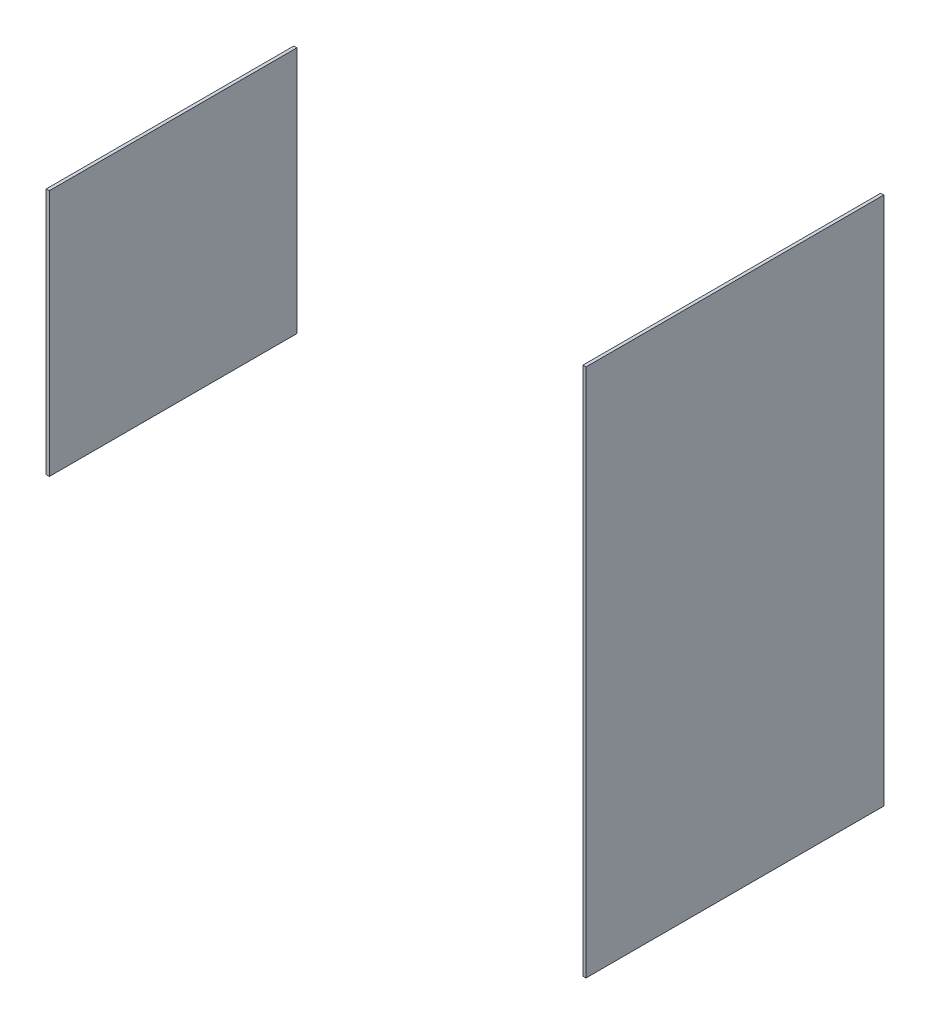
ISO-10303-21;
HEADER;
FILE_DESCRIPTION(('STEP AP214'),'2;1');
FILE_NAME('part.step','',(''),(''),'','','');
FILE_SCHEMA(('AUTOMOTIVE_DESIGN { 1 0 10303 214 1 1 1 1 }'));
ENDSEC;
DATA;
#1=APPLICATION_CONTEXT('core data for automotive mechanical design processes');
#2=APPLICATION_PROTOCOL_DEFINITION('international standard','automotive_design',2000,#1);
#3=PRODUCT_CONTEXT('',#1,'mechanical');
#4=PRODUCT('Part','Part','',(#3));
#5=PRODUCT_RELATED_PRODUCT_CATEGORY('part','',(#4));
#6=PRODUCT_DEFINITION_FORMATION('','',#4);
#7=PRODUCT_DEFINITION_CONTEXT('part definition',#1,'design');
#8=PRODUCT_DEFINITION('design','',#6,#7);
#9=PRODUCT_DEFINITION_SHAPE('','',#8);
#10=(LENGTH_UNIT() NAMED_UNIT(*) SI_UNIT(.MILLI.,.METRE.));
#11=(NAMED_UNIT(*) PLANE_ANGLE_UNIT() SI_UNIT($,.RADIAN.));
#12=(NAMED_UNIT(*) SI_UNIT($,.STERADIAN.) SOLID_ANGLE_UNIT());
#13=UNCERTAINTY_MEASURE_WITH_UNIT(LENGTH_MEASURE(1.E-05),#10,'distance_accuracy_value','');
#14=(GEOMETRIC_REPRESENTATION_CONTEXT(3) GLOBAL_UNCERTAINTY_ASSIGNED_CONTEXT((#13)) GLOBAL_UNIT_ASSIGNED_CONTEXT((#10,
#11,#12)) REPRESENTATION_CONTEXT('',''));
#15=CARTESIAN_POINT('',(0.,0.,0.));
#16=DIRECTION('',(0.,0.,1.));
#17=DIRECTION('',(1.,0.,0.));
#18=AXIS2_PLACEMENT_3D('',#15,#16,#17);
#19=CARTESIAN_POINT('',(732.99591770085,0.,0.));
#20=DIRECTION('',(1.,0.,0.));
#21=DIRECTION('',(0.,0.,-1.));
#22=AXIS2_PLACEMENT_3D('',#19,#20,#21);
#23=PLANE('',#22);
#24=DIRECTION('',(0.,1.,0.));
#25=VECTOR('',#24,1.);
#26=CARTESIAN_POINT('',(732.995917700849,254.635,-143.256));
#27=LINE('',#26,#25);
#28=CARTESIAN_POINT('',(732.995917700849,-254.635,-143.256));
#29=VERTEX_POINT('',#28);
#30=CARTESIAN_POINT('',(732.995917700849,254.635,-143.256));
#31=VERTEX_POINT('',#30);
#32=EDGE_CURVE('E82',#29,#31,#27,.T.);
#33=ORIENTED_EDGE('',*,*,#32,.T.);
#34=DIRECTION('',(0.,0.,1.));
#35=VECTOR('',#34,1.);
#36=CARTESIAN_POINT('',(732.995917700849,254.635,-143.256));
#37=LINE('',#36,#35);
#38=CARTESIAN_POINT('',(732.995917700849,254.635,143.256));
#39=VERTEX_POINT('',#38);
#40=EDGE_CURVE('E54',#31,#39,#37,.T.);
#41=ORIENTED_EDGE('',*,*,#40,.T.);
#42=DIRECTION('',(0.,-1.,0.));
#43=VECTOR('',#42,1.);
#44=CARTESIAN_POINT('',(732.995917700849,254.635,143.256));
#45=LINE('',#44,#43);
#46=CARTESIAN_POINT('',(732.995917700849,-254.635,143.256));
#47=VERTEX_POINT('',#46);
#48=EDGE_CURVE('E88',#39,#47,#45,.T.);
#49=ORIENTED_EDGE('',*,*,#48,.T.);
#50=DIRECTION('',(0.,0.,-1.));
#51=VECTOR('',#50,1.);
#52=CARTESIAN_POINT('',(732.995917700849,-254.635,-143.256));
#53=LINE('',#52,#51);
#54=EDGE_CURVE('E85',#47,#29,#53,.T.);
#55=ORIENTED_EDGE('',*,*,#54,.T.);
#56=EDGE_LOOP('',(#33,#41,#49,#55));
#57=FACE_BOUND('',#56,.T.);
#58=ADVANCED_FACE('F45',(#57),#23,.T.);
#59=CARTESIAN_POINT('',(729.99591770085,0.,0.));
#60=DIRECTION('',(1.,0.,0.));
#61=DIRECTION('',(0.,0.,-1.));
#62=AXIS2_PLACEMENT_3D('',#59,#60,#61);
#63=PLANE('',#62);
#64=DIRECTION('',(0.,1.,0.));
#65=VECTOR('',#64,1.);
#66=CARTESIAN_POINT('',(729.995917700849,254.635,-143.256));
#67=LINE('',#66,#65);
#68=CARTESIAN_POINT('',(729.995917700849,-254.635,-143.256));
#69=VERTEX_POINT('',#68);
#70=CARTESIAN_POINT('',(729.995917700849,254.635,-143.256));
#71=VERTEX_POINT('',#70);
#72=EDGE_CURVE('E102',#69,#71,#67,.T.);
#73=ORIENTED_EDGE('',*,*,#72,.F.);
#74=DIRECTION('',(0.,0.,-1.));
#75=VECTOR('',#74,1.);
#76=CARTESIAN_POINT('',(729.995917700849,-254.635,-143.256));
#77=LINE('',#76,#75);
#78=CARTESIAN_POINT('',(729.995917700849,-254.635,143.256));
#79=VERTEX_POINT('',#78);
#80=EDGE_CURVE('E99',#79,#69,#77,.T.);
#81=ORIENTED_EDGE('',*,*,#80,.F.);
#82=DIRECTION('',(0.,-1.,0.));
#83=VECTOR('',#82,1.);
#84=CARTESIAN_POINT('',(729.995917700849,254.635,143.256));
#85=LINE('',#84,#83);
#86=CARTESIAN_POINT('',(729.995917700849,254.635,143.256));
#87=VERTEX_POINT('',#86);
#88=EDGE_CURVE('E63',#87,#79,#85,.T.);
#89=ORIENTED_EDGE('',*,*,#88,.F.);
#90=DIRECTION('',(0.,0.,1.));
#91=VECTOR('',#90,1.);
#92=CARTESIAN_POINT('',(729.995917700849,254.635,-143.256));
#93=LINE('',#92,#91);
#94=EDGE_CURVE('E13',#71,#87,#93,.T.);
#95=ORIENTED_EDGE('',*,*,#94,.F.);
#96=EDGE_LOOP('',(#73,#81,#89,#95));
#97=FACE_BOUND('',#96,.T.);
#98=ADVANCED_FACE('F141',(#97),#63,.F.);
#99=CARTESIAN_POINT('',(729.995917700849,254.635,-143.256));
#100=DIRECTION('',(0.,0.,-1.));
#101=DIRECTION('',(0.,1.,0.));
#102=AXIS2_PLACEMENT_3D('',#99,#100,#101);
#103=PLANE('',#102);
#104=ORIENTED_EDGE('',*,*,#32,.F.);
#105=DIRECTION('',(1.,0.,0.));
#106=VECTOR('',#105,1.);
#107=CARTESIAN_POINT('',(729.995917700849,-254.635,-143.256));
#108=LINE('',#107,#106);
#109=EDGE_CURVE('E97',#69,#29,#108,.T.);
#110=ORIENTED_EDGE('',*,*,#109,.F.);
#111=ORIENTED_EDGE('',*,*,#72,.T.);
#112=DIRECTION('',(1.,0.,0.));
#113=VECTOR('',#112,1.);
#114=CARTESIAN_POINT('',(729.995917700849,254.635,-143.256));
#115=LINE('',#114,#113);
#116=EDGE_CURVE('E93',#71,#31,#115,.T.);
#117=ORIENTED_EDGE('',*,*,#116,.T.);
#118=EDGE_LOOP('',(#104,#110,#111,#117));
#119=FACE_BOUND('',#118,.T.);
#120=ADVANCED_FACE('F103',(#119),#103,.T.);
#121=CARTESIAN_POINT('',(729.995917700849,-254.635,-143.256));
#122=DIRECTION('',(0.,-1.,0.));
#123=DIRECTION('',(0.,0.,-1.));
#124=AXIS2_PLACEMENT_3D('',#121,#122,#123);
#125=PLANE('',#124);
#126=ORIENTED_EDGE('',*,*,#54,.F.);
#127=DIRECTION('',(1.,0.,0.));
#128=VECTOR('',#127,1.);
#129=CARTESIAN_POINT('',(729.995917700849,-254.635,143.256));
#130=LINE('',#129,#128);
#131=EDGE_CURVE('E92',#79,#47,#130,.T.);
#132=ORIENTED_EDGE('',*,*,#131,.F.);
#133=ORIENTED_EDGE('',*,*,#80,.T.);
#134=ORIENTED_EDGE('',*,*,#109,.T.);
#135=EDGE_LOOP('',(#126,#132,#133,#134));
#136=FACE_BOUND('',#135,.T.);
#137=ADVANCED_FACE('F98',(#136),#125,.T.);
#138=CARTESIAN_POINT('',(729.995917700849,254.635,143.256));
#139=DIRECTION('',(0.,0.,1.));
#140=DIRECTION('',(0.,-1.,0.));
#141=AXIS2_PLACEMENT_3D('',#138,#139,#140);
#142=PLANE('',#141);
#143=ORIENTED_EDGE('',*,*,#48,.F.);
#144=DIRECTION('',(1.,0.,0.));
#145=VECTOR('',#144,1.);
#146=CARTESIAN_POINT('',(729.995917700849,254.635,143.256));
#147=LINE('',#146,#145);
#148=EDGE_CURVE('E117',#87,#39,#147,.T.);
#149=ORIENTED_EDGE('',*,*,#148,.F.);
#150=ORIENTED_EDGE('',*,*,#88,.T.);
#151=ORIENTED_EDGE('',*,*,#131,.T.);
#152=EDGE_LOOP('',(#143,#149,#150,#151));
#153=FACE_BOUND('',#152,.T.);
#154=ADVANCED_FACE('F128',(#153),#142,.T.);
#155=CARTESIAN_POINT('',(729.995917700849,254.635,-143.256));
#156=DIRECTION('',(0.,1.,0.));
#157=DIRECTION('',(0.,0.,1.));
#158=AXIS2_PLACEMENT_3D('',#155,#156,#157);
#159=PLANE('',#158);
#160=ORIENTED_EDGE('',*,*,#40,.F.);
#161=ORIENTED_EDGE('',*,*,#116,.F.);
#162=ORIENTED_EDGE('',*,*,#94,.T.);
#163=ORIENTED_EDGE('',*,*,#148,.T.);
#164=EDGE_LOOP('',(#160,#161,#162,#163));
#165=FACE_BOUND('',#164,.T.);
#166=ADVANCED_FACE('F143',(#165),#159,.T.);
#167=CLOSED_SHELL('',(#58,#98,#120,#137,#154,#166));
#168=MANIFOLD_SOLID_BREP('B2',#167);
#169=CARTESIAN_POINT('',(192.397958850424,0.,0.));
#170=DIRECTION('',(-1.,0.,0.));
#171=DIRECTION('',(0.,0.,1.));
#172=AXIS2_PLACEMENT_3D('',#169,#170,#171);
#173=PLANE('',#172);
#174=DIRECTION('',(0.,1.,0.));
#175=VECTOR('',#174,1.);
#176=CARTESIAN_POINT('',(192.397958850425,119.090816198994,119.090816198994));
#177=LINE('',#176,#175);
#178=CARTESIAN_POINT('',(192.397958850425,-119.090816198994,119.090816198994));
#179=VERTEX_POINT('',#178);
#180=CARTESIAN_POINT('',(192.397958850424,119.090816198994,119.090816198994));
#181=VERTEX_POINT('',#180);
#182=EDGE_CURVE('E233',#179,#181,#177,.T.);
#183=ORIENTED_EDGE('',*,*,#182,.F.);
#184=DIRECTION('',(0.,0.,1.));
#185=VECTOR('',#184,1.);
#186=CARTESIAN_POINT('',(192.397958850425,-119.090816198994,119.090816198994));
#187=LINE('',#186,#185);
#188=CARTESIAN_POINT('',(192.397958850425,-119.090816198994,-119.090816198994));
#189=VERTEX_POINT('',#188);
#190=EDGE_CURVE('E240',#189,#179,#187,.T.);
#191=ORIENTED_EDGE('',*,*,#190,.F.);
#192=DIRECTION('',(0.,-1.,0.));
#193=VECTOR('',#192,1.);
#194=CARTESIAN_POINT('',(192.397958850424,119.090816198994,-119.090816198994));
#195=LINE('',#194,#193);
#196=CARTESIAN_POINT('',(192.397958850424,119.090816198994,-119.090816198994));
#197=VERTEX_POINT('',#196);
#198=EDGE_CURVE('E263',#197,#189,#195,.T.);
#199=ORIENTED_EDGE('',*,*,#198,.F.);
#200=DIRECTION('',(0.,0.,-1.));
#201=VECTOR('',#200,1.);
#202=CARTESIAN_POINT('',(192.397958850425,119.090816198994,119.090816198994));
#203=LINE('',#202,#201);
#204=EDGE_CURVE('E202',#181,#197,#203,.T.);
#205=ORIENTED_EDGE('',*,*,#204,.F.);
#206=EDGE_LOOP('',(#183,#191,#199,#205));
#207=FACE_BOUND('',#206,.T.);
#208=ADVANCED_FACE('F193',(#207),#173,.F.);
#209=CARTESIAN_POINT('',(189.397958850424,0.,0.));
#210=DIRECTION('',(-1.,0.,0.));
#211=DIRECTION('',(0.,0.,1.));
#212=AXIS2_PLACEMENT_3D('',#209,#210,#211);
#213=PLANE('',#212);
#214=DIRECTION('',(0.,1.,0.));
#215=VECTOR('',#214,1.);
#216=CARTESIAN_POINT('',(189.397958850425,119.090816198994,119.090816198994));
#217=LINE('',#216,#215);
#218=CARTESIAN_POINT('',(189.397958850425,-119.090816198994,119.090816198994));
#219=VERTEX_POINT('',#218);
#220=CARTESIAN_POINT('',(189.397958850424,119.090816198994,119.090816198994));
#221=VERTEX_POINT('',#220);
#222=EDGE_CURVE('E251',#219,#221,#217,.T.);
#223=ORIENTED_EDGE('',*,*,#222,.T.);
#224=DIRECTION('',(0.,0.,-1.));
#225=VECTOR('',#224,1.);
#226=CARTESIAN_POINT('',(189.397958850425,119.090816198994,119.090816198994));
#227=LINE('',#226,#225);
#228=CARTESIAN_POINT('',(189.397958850424,119.090816198994,-119.090816198994));
#229=VERTEX_POINT('',#228);
#230=EDGE_CURVE('E43',#221,#229,#227,.T.);
#231=ORIENTED_EDGE('',*,*,#230,.T.);
#232=DIRECTION('',(0.,-1.,0.));
#233=VECTOR('',#232,1.);
#234=CARTESIAN_POINT('',(189.397958850424,119.090816198994,-119.090816198994));
#235=LINE('',#234,#233);
#236=CARTESIAN_POINT('',(189.397958850425,-119.090816198994,-119.090816198994));
#237=VERTEX_POINT('',#236);
#238=EDGE_CURVE('E211',#229,#237,#235,.T.);
#239=ORIENTED_EDGE('',*,*,#238,.T.);
#240=DIRECTION('',(0.,0.,1.));
#241=VECTOR('',#240,1.);
#242=CARTESIAN_POINT('',(189.397958850425,-119.090816198994,119.090816198994));
#243=LINE('',#242,#241);
#244=EDGE_CURVE('E266',#237,#219,#243,.T.);
#245=ORIENTED_EDGE('',*,*,#244,.T.);
#246=EDGE_LOOP('',(#223,#231,#239,#245));
#247=FACE_BOUND('',#246,.T.);
#248=ADVANCED_FACE('F277',(#247),#213,.T.);
#249=CARTESIAN_POINT('',(189.397958850425,119.090816198994,119.090816198994));
#250=DIRECTION('',(0.,0.,-1.));
#251=DIRECTION('',(-1.,0.,0.));
#252=AXIS2_PLACEMENT_3D('',#249,#250,#251);
#253=PLANE('',#252);
#254=ORIENTED_EDGE('',*,*,#182,.T.);
#255=DIRECTION('',(1.,0.,0.));
#256=VECTOR('',#255,1.);
#257=CARTESIAN_POINT('',(189.397958850425,119.090816198994,119.090816198994));
#258=LINE('',#257,#256);
#259=EDGE_CURVE('E247',#221,#181,#258,.T.);
#260=ORIENTED_EDGE('',*,*,#259,.F.);
#261=ORIENTED_EDGE('',*,*,#222,.F.);
#262=DIRECTION('',(1.,0.,0.));
#263=VECTOR('',#262,1.);
#264=CARTESIAN_POINT('',(189.397958850425,-119.090816198994,119.090816198994));
#265=LINE('',#264,#263);
#266=EDGE_CURVE('E242',#219,#179,#265,.T.);
#267=ORIENTED_EDGE('',*,*,#266,.T.);
#268=EDGE_LOOP('',(#254,#260,#261,#267));
#269=FACE_BOUND('',#268,.T.);
#270=ADVANCED_FACE('F249',(#269),#253,.F.);
#271=CARTESIAN_POINT('',(189.397958850425,-119.090816198994,119.090816198994));
#272=DIRECTION('',(0.,1.,0.));
#273=DIRECTION('',(0.,0.,1.));
#274=AXIS2_PLACEMENT_3D('',#271,#272,#273);
#275=PLANE('',#274);
#276=ORIENTED_EDGE('',*,*,#190,.T.);
#277=ORIENTED_EDGE('',*,*,#266,.F.);
#278=ORIENTED_EDGE('',*,*,#244,.F.);
#279=DIRECTION('',(1.,0.,0.));
#280=VECTOR('',#279,1.);
#281=CARTESIAN_POINT('',(189.397958850425,-119.090816198994,-119.090816198994));
#282=LINE('',#281,#280);
#283=EDGE_CURVE('E244',#237,#189,#282,.T.);
#284=ORIENTED_EDGE('',*,*,#283,.T.);
#285=EDGE_LOOP('',(#276,#277,#278,#284));
#286=FACE_BOUND('',#285,.T.);
#287=ADVANCED_FACE('F241',(#286),#275,.F.);
#288=CARTESIAN_POINT('',(189.397958850424,119.090816198994,-119.090816198994));
#289=DIRECTION('',(0.,0.,1.));
#290=DIRECTION('',(1.,0.,0.));
#291=AXIS2_PLACEMENT_3D('',#288,#289,#290);
#292=PLANE('',#291);
#293=ORIENTED_EDGE('',*,*,#198,.T.);
#294=ORIENTED_EDGE('',*,*,#283,.F.);
#295=ORIENTED_EDGE('',*,*,#238,.F.);
#296=DIRECTION('',(1.,0.,0.));
#297=VECTOR('',#296,1.);
#298=CARTESIAN_POINT('',(189.397958850424,119.090816198994,-119.090816198994));
#299=LINE('',#298,#297);
#300=EDGE_CURVE('E265',#229,#197,#299,.T.);
#301=ORIENTED_EDGE('',*,*,#300,.T.);
#302=EDGE_LOOP('',(#293,#294,#295,#301));
#303=FACE_BOUND('',#302,.T.);
#304=ADVANCED_FACE('F278',(#303),#292,.F.);
#305=CARTESIAN_POINT('',(189.397958850425,119.090816198994,119.090816198994));
#306=DIRECTION('',(0.,-1.,0.));
#307=DIRECTION('',(0.,0.,-1.));
#308=AXIS2_PLACEMENT_3D('',#305,#306,#307);
#309=PLANE('',#308);
#310=ORIENTED_EDGE('',*,*,#204,.T.);
#311=ORIENTED_EDGE('',*,*,#300,.F.);
#312=ORIENTED_EDGE('',*,*,#230,.F.);
#313=ORIENTED_EDGE('',*,*,#259,.T.);
#314=EDGE_LOOP('',(#310,#311,#312,#313));
#315=FACE_BOUND('',#314,.T.);
#316=ADVANCED_FACE('F291',(#315),#309,.F.);
#317=CLOSED_SHELL('',(#208,#248,#270,#287,#304,#316));
#318=MANIFOLD_SOLID_BREP('B7',#317);
#319=ADVANCED_BREP_SHAPE_REPRESENTATION('',(#18,#168,#318),#14);
#320=SHAPE_DEFINITION_REPRESENTATION(#9,#319);
ENDSEC;
END-ISO-10303-21;
